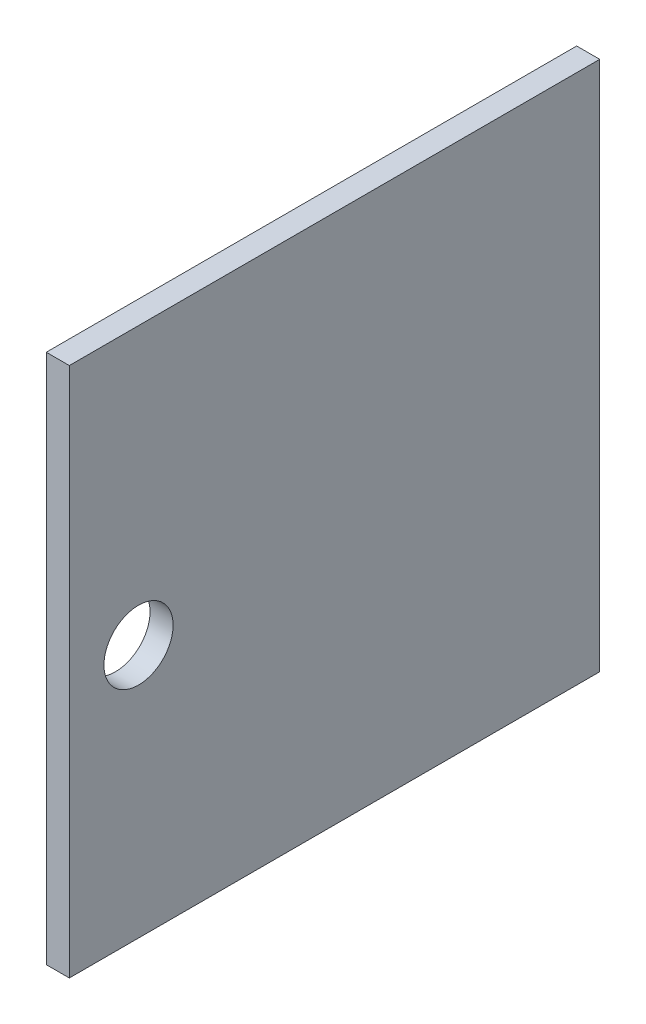
ISO-10303-21;
HEADER;
FILE_DESCRIPTION(('STEP AP214'),'2;1');
FILE_NAME('part.step','',(''),(''),'','','');
FILE_SCHEMA(('AUTOMOTIVE_DESIGN { 1 0 10303 214 1 1 1 1 }'));
ENDSEC;
DATA;
#1=APPLICATION_CONTEXT('core data for automotive mechanical design processes');
#2=APPLICATION_PROTOCOL_DEFINITION('international standard','automotive_design',2000,#1);
#3=PRODUCT_CONTEXT('',#1,'mechanical');
#4=PRODUCT('Part','Part','',(#3));
#5=PRODUCT_RELATED_PRODUCT_CATEGORY('part','',(#4));
#6=PRODUCT_DEFINITION_FORMATION('','',#4);
#7=PRODUCT_DEFINITION_CONTEXT('part definition',#1,'design');
#8=PRODUCT_DEFINITION('design','',#6,#7);
#9=PRODUCT_DEFINITION_SHAPE('','',#8);
#10=(LENGTH_UNIT() NAMED_UNIT(*) SI_UNIT(.MILLI.,.METRE.));
#11=(NAMED_UNIT(*) PLANE_ANGLE_UNIT() SI_UNIT($,.RADIAN.));
#12=(NAMED_UNIT(*) SI_UNIT($,.STERADIAN.) SOLID_ANGLE_UNIT());
#13=UNCERTAINTY_MEASURE_WITH_UNIT(LENGTH_MEASURE(1.E-05),#10,'distance_accuracy_value','');
#14=(GEOMETRIC_REPRESENTATION_CONTEXT(3) GLOBAL_UNCERTAINTY_ASSIGNED_CONTEXT((#13)) GLOBAL_UNIT_ASSIGNED_CONTEXT((#10,
#11,#12)) REPRESENTATION_CONTEXT('',''));
#15=CARTESIAN_POINT('',(0.,0.,0.));
#16=DIRECTION('',(0.,0.,1.));
#17=DIRECTION('',(1.,0.,0.));
#18=AXIS2_PLACEMENT_3D('',#15,#16,#17);
#19=CARTESIAN_POINT('',(-5.,109.111842105263,38.4868421052632));
#20=DIRECTION('',(0.,0.,1.));
#21=DIRECTION('',(0.,-1.,0.));
#22=AXIS2_PLACEMENT_3D('',#19,#20,#21);
#23=PLANE('',#22);
#24=DIRECTION('',(0.,-1.,0.));
#25=VECTOR('',#24,1.);
#26=CARTESIAN_POINT('',(0.,109.111842105263,38.4868421052632));
#27=LINE('',#26,#25);
#28=CARTESIAN_POINT('',(0.,109.111842105263,38.4868421052632));
#29=VERTEX_POINT('',#28);
#30=CARTESIAN_POINT('',(0.,-5.88815789473687,38.4868421052632));
#31=VERTEX_POINT('',#30);
#32=EDGE_CURVE('E98',#29,#31,#27,.T.);
#33=ORIENTED_EDGE('',*,*,#32,.F.);
#34=DIRECTION('',(1.,0.,0.));
#35=VECTOR('',#34,1.);
#36=CARTESIAN_POINT('',(-5.,109.111842105263,38.4868421052632));
#37=LINE('',#36,#35);
#38=CARTESIAN_POINT('',(-5.,109.111842105263,38.4868421052632));
#39=VERTEX_POINT('',#38);
#40=EDGE_CURVE('E11',#39,#29,#37,.T.);
#41=ORIENTED_EDGE('',*,*,#40,.F.);
#42=DIRECTION('',(0.,-1.,0.));
#43=VECTOR('',#42,1.);
#44=CARTESIAN_POINT('',(-5.,109.111842105263,38.4868421052632));
#45=LINE('',#44,#43);
#46=CARTESIAN_POINT('',(-5.,-5.88815789473687,38.4868421052632));
#47=VERTEX_POINT('',#46);
#48=EDGE_CURVE('E91',#39,#47,#45,.T.);
#49=ORIENTED_EDGE('',*,*,#48,.T.);
#50=DIRECTION('',(1.,0.,0.));
#51=VECTOR('',#50,1.);
#52=CARTESIAN_POINT('',(-5.,-5.88815789473687,38.4868421052632));
#53=LINE('',#52,#51);
#54=EDGE_CURVE('E36',#47,#31,#53,.T.);
#55=ORIENTED_EDGE('',*,*,#54,.T.);
#56=EDGE_LOOP('',(#33,#41,#49,#55));
#57=FACE_BOUND('',#56,.T.);
#58=ADVANCED_FACE('F33',(#57),#23,.T.);
#59=CARTESIAN_POINT('',(-5.,109.111842105263,38.4868421052632));
#60=DIRECTION('',(0.,1.,0.));
#61=DIRECTION('',(0.,0.,1.));
#62=AXIS2_PLACEMENT_3D('',#59,#60,#61);
#63=PLANE('',#62);
#64=DIRECTION('',(0.,0.,1.));
#65=VECTOR('',#64,1.);
#66=CARTESIAN_POINT('',(0.,109.111842105263,38.4868421052632));
#67=LINE('',#66,#65);
#68=CARTESIAN_POINT('',(0.,109.111842105263,-76.5131578947368));
#69=VERTEX_POINT('',#68);
#70=EDGE_CURVE('E93',#69,#29,#67,.T.);
#71=ORIENTED_EDGE('',*,*,#70,.F.);
#72=DIRECTION('',(1.,0.,0.));
#73=VECTOR('',#72,1.);
#74=CARTESIAN_POINT('',(-5.,109.111842105263,-76.5131578947368));
#75=LINE('',#74,#73);
#76=CARTESIAN_POINT('',(-5.,109.111842105263,-76.5131578947368));
#77=VERTEX_POINT('',#76);
#78=EDGE_CURVE('E42',#77,#69,#75,.T.);
#79=ORIENTED_EDGE('',*,*,#78,.F.);
#80=DIRECTION('',(0.,0.,1.));
#81=VECTOR('',#80,1.);
#82=CARTESIAN_POINT('',(-5.,109.111842105263,38.4868421052632));
#83=LINE('',#82,#81);
#84=EDGE_CURVE('E88',#77,#39,#83,.T.);
#85=ORIENTED_EDGE('',*,*,#84,.T.);
#86=ORIENTED_EDGE('',*,*,#40,.T.);
#87=EDGE_LOOP('',(#71,#79,#85,#86));
#88=FACE_BOUND('',#87,.T.);
#89=ADVANCED_FACE('F109',(#88),#63,.T.);
#90=CARTESIAN_POINT('',(-5.,109.111842105263,-76.5131578947368));
#91=DIRECTION('',(0.,0.,-1.));
#92=DIRECTION('',(0.,1.,0.));
#93=AXIS2_PLACEMENT_3D('',#90,#91,#92);
#94=PLANE('',#93);
#95=DIRECTION('',(0.,1.,0.));
#96=VECTOR('',#95,1.);
#97=CARTESIAN_POINT('',(0.,109.111842105263,-76.5131578947368));
#98=LINE('',#97,#96);
#99=CARTESIAN_POINT('',(0.,-5.88815789473687,-76.5131578947368));
#100=VERTEX_POINT('',#99);
#101=EDGE_CURVE('E83',#100,#69,#98,.T.);
#102=ORIENTED_EDGE('',*,*,#101,.F.);
#103=DIRECTION('',(1.,0.,0.));
#104=VECTOR('',#103,1.);
#105=CARTESIAN_POINT('',(-5.,-5.88815789473687,-76.5131578947368));
#106=LINE('',#105,#104);
#107=CARTESIAN_POINT('',(-5.,-5.88815789473687,-76.5131578947368));
#108=VERTEX_POINT('',#107);
#109=EDGE_CURVE('E78',#108,#100,#106,.T.);
#110=ORIENTED_EDGE('',*,*,#109,.F.);
#111=DIRECTION('',(0.,1.,0.));
#112=VECTOR('',#111,1.);
#113=CARTESIAN_POINT('',(-5.,109.111842105263,-76.5131578947368));
#114=LINE('',#113,#112);
#115=EDGE_CURVE('E81',#108,#77,#114,.T.);
#116=ORIENTED_EDGE('',*,*,#115,.T.);
#117=ORIENTED_EDGE('',*,*,#78,.T.);
#118=EDGE_LOOP('',(#102,#110,#116,#117));
#119=FACE_BOUND('',#118,.T.);
#120=ADVANCED_FACE('F80',(#119),#94,.T.);
#121=CARTESIAN_POINT('',(-5.,-5.88815789473687,38.4868421052632));
#122=DIRECTION('',(0.,-1.,0.));
#123=DIRECTION('',(0.,0.,-1.));
#124=AXIS2_PLACEMENT_3D('',#121,#122,#123);
#125=PLANE('',#124);
#126=DIRECTION('',(0.,0.,-1.));
#127=VECTOR('',#126,1.);
#128=CARTESIAN_POINT('',(0.,-5.88815789473687,38.4868421052632));
#129=LINE('',#128,#127);
#130=EDGE_CURVE('E101',#31,#100,#129,.T.);
#131=ORIENTED_EDGE('',*,*,#130,.F.);
#132=ORIENTED_EDGE('',*,*,#54,.F.);
#133=DIRECTION('',(0.,0.,-1.));
#134=VECTOR('',#133,1.);
#135=CARTESIAN_POINT('',(-5.,-5.88815789473687,38.4868421052632));
#136=LINE('',#135,#134);
#137=EDGE_CURVE('E87',#47,#108,#136,.T.);
#138=ORIENTED_EDGE('',*,*,#137,.T.);
#139=ORIENTED_EDGE('',*,*,#109,.T.);
#140=EDGE_LOOP('',(#131,#132,#138,#139));
#141=FACE_BOUND('',#140,.T.);
#142=ADVANCED_FACE('F90',(#141),#125,.T.);
#143=CARTESIAN_POINT('',(-5.,0.,0.));
#144=DIRECTION('',(1.,0.,0.));
#145=DIRECTION('',(0.,0.,-1.));
#146=AXIS2_PLACEMENT_3D('',#143,#144,#145);
#147=PLANE('',#146);
#148=CARTESIAN_POINT('',(-5.,49.1118421052631,23.4868421052632));
#149=DIRECTION('',(1.,0.,0.));
#150=DIRECTION('',(0.,0.,-1.));
#151=AXIS2_PLACEMENT_3D('',#148,#149,#150);
#152=CIRCLE('',#151,7.5);
#153=CARTESIAN_POINT('',(-5.,49.1118421052631,15.9868421052632));
#154=VERTEX_POINT('',#153);
#155=EDGE_CURVE('E102',#154,#154,#152,.T.);
#156=ORIENTED_EDGE('',*,*,#155,.T.);
#157=EDGE_LOOP('',(#156));
#158=FACE_BOUND('',#157,.T.);
#159=ORIENTED_EDGE('',*,*,#48,.F.);
#160=ORIENTED_EDGE('',*,*,#84,.F.);
#161=ORIENTED_EDGE('',*,*,#115,.F.);
#162=ORIENTED_EDGE('',*,*,#137,.F.);
#163=EDGE_LOOP('',(#159,#160,#161,#162));
#164=FACE_BOUND('',#163,.T.);
#165=ADVANCED_FACE('F86',(#158,#164),#147,.F.);
#166=CARTESIAN_POINT('',(0.,0.,0.));
#167=DIRECTION('',(1.,0.,0.));
#168=DIRECTION('',(0.,0.,-1.));
#169=AXIS2_PLACEMENT_3D('',#166,#167,#168);
#170=PLANE('',#169);
#171=CARTESIAN_POINT('',(0.,49.1118421052631,23.4868421052632));
#172=DIRECTION('',(1.,0.,0.));
#173=DIRECTION('',(0.,0.,-1.));
#174=AXIS2_PLACEMENT_3D('',#171,#172,#173);
#175=CIRCLE('',#174,7.5);
#176=CARTESIAN_POINT('',(0.,49.1118421052631,15.9868421052632));
#177=VERTEX_POINT('',#176);
#178=EDGE_CURVE('E139',#177,#177,#175,.T.);
#179=ORIENTED_EDGE('',*,*,#178,.F.);
#180=EDGE_LOOP('',(#179));
#181=FACE_BOUND('',#180,.T.);
#182=ORIENTED_EDGE('',*,*,#32,.T.);
#183=ORIENTED_EDGE('',*,*,#130,.T.);
#184=ORIENTED_EDGE('',*,*,#101,.T.);
#185=ORIENTED_EDGE('',*,*,#70,.T.);
#186=EDGE_LOOP('',(#182,#183,#184,#185));
#187=FACE_BOUND('',#186,.T.);
#188=ADVANCED_FACE('F108',(#181,#187),#170,.T.);
#189=CARTESIAN_POINT('',(-5.,49.1118421052631,23.4868421052632));
#190=DIRECTION('',(1.,0.,0.));
#191=DIRECTION('',(0.,0.,-1.));
#192=AXIS2_PLACEMENT_3D('',#189,#190,#191);
#193=CYLINDRICAL_SURFACE('',#192,7.5);
#194=ORIENTED_EDGE('',*,*,#155,.F.);
#195=EDGE_LOOP('',(#194));
#196=FACE_BOUND('',#195,.T.);
#197=ORIENTED_EDGE('',*,*,#178,.T.);
#198=EDGE_LOOP('',(#197));
#199=FACE_BOUND('',#198,.T.);
#200=ADVANCED_FACE('F127',(#196,#199),#193,.F.);
#201=CLOSED_SHELL('',(#58,#89,#120,#142,#165,#188,#200));
#202=MANIFOLD_SOLID_BREP('B2',#201);
#203=ADVANCED_BREP_SHAPE_REPRESENTATION('',(#18,#202),#14);
#204=SHAPE_DEFINITION_REPRESENTATION(#9,#203);
ENDSEC;
END-ISO-10303-21;
